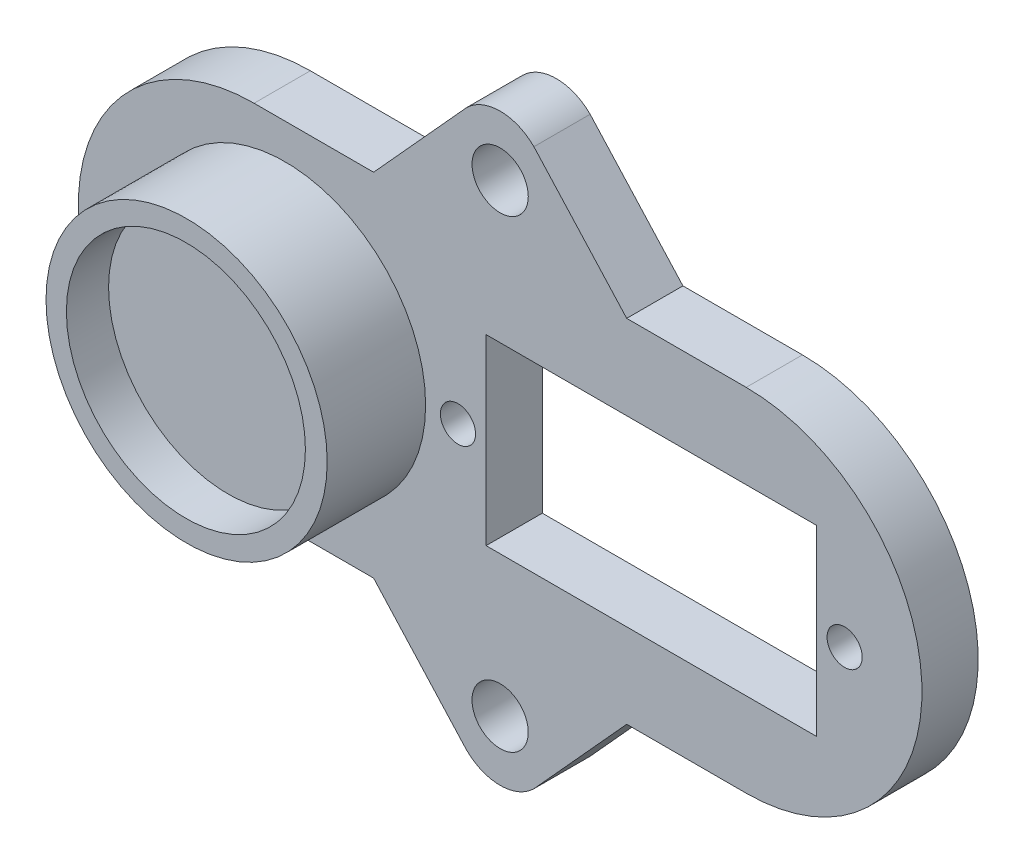
ISO-10303-21;
HEADER;
FILE_DESCRIPTION(('STEP AP214'),'2;1');
FILE_NAME('part.step','',(''),(''),'','','');
FILE_SCHEMA(('AUTOMOTIVE_DESIGN { 1 0 10303 214 1 1 1 1 }'));
ENDSEC;
DATA;
#1=APPLICATION_CONTEXT('core data for automotive mechanical design processes');
#2=APPLICATION_PROTOCOL_DEFINITION('international standard','automotive_design',2000,#1);
#3=PRODUCT_CONTEXT('',#1,'mechanical');
#4=PRODUCT('Part','Part','',(#3));
#5=PRODUCT_RELATED_PRODUCT_CATEGORY('part','',(#4));
#6=PRODUCT_DEFINITION_FORMATION('','',#4);
#7=PRODUCT_DEFINITION_CONTEXT('part definition',#1,'design');
#8=PRODUCT_DEFINITION('design','',#6,#7);
#9=PRODUCT_DEFINITION_SHAPE('','',#8);
#10=(LENGTH_UNIT() NAMED_UNIT(*) SI_UNIT(.MILLI.,.METRE.));
#11=(NAMED_UNIT(*) PLANE_ANGLE_UNIT() SI_UNIT($,.RADIAN.));
#12=(NAMED_UNIT(*) SI_UNIT($,.STERADIAN.) SOLID_ANGLE_UNIT());
#13=UNCERTAINTY_MEASURE_WITH_UNIT(LENGTH_MEASURE(1.E-05),#10,'distance_accuracy_value','');
#14=(GEOMETRIC_REPRESENTATION_CONTEXT(3) GLOBAL_UNCERTAINTY_ASSIGNED_CONTEXT((#13)) GLOBAL_UNIT_ASSIGNED_CONTEXT((#10,
#11,#12)) REPRESENTATION_CONTEXT('',''));
#15=CARTESIAN_POINT('',(0.,0.,0.));
#16=DIRECTION('',(0.,0.,1.));
#17=DIRECTION('',(1.,0.,0.));
#18=AXIS2_PLACEMENT_3D('',#15,#16,#17);
#19=CARTESIAN_POINT('',(17.5,0.,4.));
#20=DIRECTION('',(0.,0.,1.));
#21=DIRECTION('',(1.,0.,0.));
#22=AXIS2_PLACEMENT_3D('',#19,#20,#21);
#23=PLANE('',#22);
#24=CARTESIAN_POINT('',(-15.3,0.,4.));
#25=DIRECTION('',(0.,0.,1.));
#26=DIRECTION('',(1.,0.,0.));
#27=AXIS2_PLACEMENT_3D('',#24,#25,#26);
#28=CIRCLE('',#27,10.);
#29=CARTESIAN_POINT('',(-5.3,0.,4.));
#30=VERTEX_POINT('',#29);
#31=EDGE_CURVE('E644',#30,#30,#28,.T.);
#32=ORIENTED_EDGE('',*,*,#31,.F.);
#33=EDGE_LOOP('',(#32));
#34=FACE_BOUND('',#33,.T.);
#35=CARTESIAN_POINT('',(0.,-16.5,4.));
#36=DIRECTION('',(0.,0.,1.));
#37=DIRECTION('',(-1.,0.,0.));
#38=AXIS2_PLACEMENT_3D('',#35,#36,#37);
#39=CIRCLE('',#38,2.);
#40=CARTESIAN_POINT('',(-2.,-16.5,4.));
#41=VERTEX_POINT('',#40);
#42=EDGE_CURVE('E211',#41,#41,#39,.T.);
#43=ORIENTED_EDGE('',*,*,#42,.F.);
#44=EDGE_LOOP('',(#43));
#45=FACE_BOUND('',#44,.T.);
#46=CARTESIAN_POINT('',(-2.99999999999999,0.,4.));
#47=DIRECTION('',(0.,0.,1.));
#48=DIRECTION('',(1.,0.,0.));
#49=AXIS2_PLACEMENT_3D('',#46,#47,#48);
#50=CIRCLE('',#49,1.25);
#51=CARTESIAN_POINT('',(-1.74999999999999,0.,4.));
#52=VERTEX_POINT('',#51);
#53=EDGE_CURVE('E227',#52,#52,#50,.T.);
#54=ORIENTED_EDGE('',*,*,#53,.F.);
#55=EDGE_LOOP('',(#54));
#56=FACE_BOUND('',#55,.T.);
#57=CARTESIAN_POINT('',(17.5,0.,4.));
#58=DIRECTION('',(0.,0.,1.));
#59=DIRECTION('',(1.,0.,0.));
#60=AXIS2_PLACEMENT_3D('',#57,#58,#59);
#61=CIRCLE('',#60,12.5);
#62=CARTESIAN_POINT('',(17.5,-12.5,4.));
#63=VERTEX_POINT('',#62);
#64=CARTESIAN_POINT('',(17.5,12.5,4.));
#65=VERTEX_POINT('',#64);
#66=EDGE_CURVE('E235',#63,#65,#61,.T.);
#67=ORIENTED_EDGE('',*,*,#66,.T.);
#68=DIRECTION('',(-1.,0.,0.));
#69=VECTOR('',#68,1.);
#70=CARTESIAN_POINT('',(9.,12.5,4.));
#71=LINE('',#70,#69);
#72=CARTESIAN_POINT('',(9.,12.5,4.));
#73=VERTEX_POINT('',#72);
#74=EDGE_CURVE('E239',#65,#73,#71,.T.);
#75=ORIENTED_EDGE('',*,*,#74,.T.);
#76=DIRECTION('',(-0.671988671110962,0.740561426148111,0.));
#77=VECTOR('',#76,1.);
#78=CARTESIAN_POINT('',(2.4010102843855,19.772380391254,4.));
#79=LINE('',#78,#77);
#80=CARTESIAN_POINT('',(2.4010102843855,19.772380391254,4.));
#81=VERTEX_POINT('',#80);
#82=EDGE_CURVE('E243',#73,#81,#79,.T.);
#83=ORIENTED_EDGE('',*,*,#82,.T.);
#84=CARTESIAN_POINT('',(0.,17.3713701068685,4.));
#85=DIRECTION('',(0.,0.,1.));
#86=DIRECTION('',(-1.,0.,0.));
#87=AXIS2_PLACEMENT_3D('',#84,#85,#86);
#88=CIRCLE('',#87,3.39554130757526);
#89=CARTESIAN_POINT('',(-2.4010102843855,19.772380391254,4.));
#90=VERTEX_POINT('',#89);
#91=EDGE_CURVE('E246',#81,#90,#88,.T.);
#92=ORIENTED_EDGE('',*,*,#91,.T.);
#93=DIRECTION('',(-0.671988671110962,-0.740561426148111,0.));
#94=VECTOR('',#93,1.);
#95=CARTESIAN_POINT('',(-9.,12.5,4.));
#96=LINE('',#95,#94);
#97=CARTESIAN_POINT('',(-9.,12.5,4.));
#98=VERTEX_POINT('',#97);
#99=EDGE_CURVE('E249',#90,#98,#96,.T.);
#100=ORIENTED_EDGE('',*,*,#99,.T.);
#101=DIRECTION('',(-1.,0.,0.));
#102=VECTOR('',#101,1.);
#103=CARTESIAN_POINT('',(-17.5,12.5,4.));
#104=LINE('',#103,#102);
#105=CARTESIAN_POINT('',(-17.5,12.5,4.));
#106=VERTEX_POINT('',#105);
#107=EDGE_CURVE('E252',#98,#106,#104,.T.);
#108=ORIENTED_EDGE('',*,*,#107,.T.);
#109=CARTESIAN_POINT('',(-17.5,0.,4.));
#110=DIRECTION('',(0.,0.,1.));
#111=DIRECTION('',(1.,0.,0.));
#112=AXIS2_PLACEMENT_3D('',#109,#110,#111);
#113=CIRCLE('',#112,12.5);
#114=CARTESIAN_POINT('',(-17.5,-12.5,4.));
#115=VERTEX_POINT('',#114);
#116=EDGE_CURVE('E255',#106,#115,#113,.T.);
#117=ORIENTED_EDGE('',*,*,#116,.T.);
#118=DIRECTION('',(1.,0.,0.));
#119=VECTOR('',#118,1.);
#120=CARTESIAN_POINT('',(-17.5,-12.5,4.));
#121=LINE('',#120,#119);
#122=CARTESIAN_POINT('',(-9.,-12.5,4.));
#123=VERTEX_POINT('',#122);
#124=EDGE_CURVE('E258',#115,#123,#121,.T.);
#125=ORIENTED_EDGE('',*,*,#124,.T.);
#126=DIRECTION('',(0.671988671110962,-0.740561426148111,0.));
#127=VECTOR('',#126,1.);
#128=CARTESIAN_POINT('',(-9.,-12.5,4.));
#129=LINE('',#128,#127);
#130=CARTESIAN_POINT('',(-2.4010102843855,-19.772380391254,4.));
#131=VERTEX_POINT('',#130);
#132=EDGE_CURVE('E261',#123,#131,#129,.T.);
#133=ORIENTED_EDGE('',*,*,#132,.T.);
#134=CARTESIAN_POINT('',(0.,-17.3713701068685,4.));
#135=DIRECTION('',(0.,0.,1.));
#136=DIRECTION('',(1.,0.,0.));
#137=AXIS2_PLACEMENT_3D('',#134,#135,#136);
#138=CIRCLE('',#137,3.39554130757526);
#139=CARTESIAN_POINT('',(2.4010102843855,-19.772380391254,4.));
#140=VERTEX_POINT('',#139);
#141=EDGE_CURVE('E264',#131,#140,#138,.T.);
#142=ORIENTED_EDGE('',*,*,#141,.T.);
#143=DIRECTION('',(0.671988671110962,0.740561426148111,0.));
#144=VECTOR('',#143,1.);
#145=CARTESIAN_POINT('',(2.4010102843855,-19.772380391254,4.));
#146=LINE('',#145,#144);
#147=CARTESIAN_POINT('',(9.,-12.5,4.));
#148=VERTEX_POINT('',#147);
#149=EDGE_CURVE('E267',#140,#148,#146,.T.);
#150=ORIENTED_EDGE('',*,*,#149,.T.);
#151=DIRECTION('',(1.,0.,0.));
#152=VECTOR('',#151,1.);
#153=CARTESIAN_POINT('',(9.,-12.5,4.));
#154=LINE('',#153,#152);
#155=EDGE_CURVE('E270',#148,#63,#154,.T.);
#156=ORIENTED_EDGE('',*,*,#155,.T.);
#157=EDGE_LOOP('',(#67,#75,#83,#92,#100,#108,#117,#125,#133,#142,#150,#156));
#158=FACE_BOUND('',#157,.T.);
#159=CARTESIAN_POINT('',(0.,16.5,4.));
#160=DIRECTION('',(0.,0.,1.));
#161=DIRECTION('',(1.,0.,0.));
#162=AXIS2_PLACEMENT_3D('',#159,#160,#161);
#163=CIRCLE('',#162,2.);
#164=CARTESIAN_POINT('',(2.,16.5,4.));
#165=VERTEX_POINT('',#164);
#166=EDGE_CURVE('E219',#165,#165,#163,.T.);
#167=ORIENTED_EDGE('',*,*,#166,.F.);
#168=EDGE_LOOP('',(#167));
#169=FACE_BOUND('',#168,.T.);
#170=CARTESIAN_POINT('',(24.5,0.,4.));
#171=DIRECTION('',(0.,0.,1.));
#172=DIRECTION('',(1.,0.,0.));
#173=AXIS2_PLACEMENT_3D('',#170,#171,#172);
#174=CIRCLE('',#173,1.25);
#175=CARTESIAN_POINT('',(25.75,0.,4.));
#176=VERTEX_POINT('',#175);
#177=EDGE_CURVE('E203',#176,#176,#174,.T.);
#178=ORIENTED_EDGE('',*,*,#177,.F.);
#179=EDGE_LOOP('',(#178));
#180=FACE_BOUND('',#179,.T.);
#181=DIRECTION('',(1.,0.,0.));
#182=VECTOR('',#181,1.);
#183=CARTESIAN_POINT('',(-0.999999999999994,-6.5,4.));
#184=LINE('',#183,#182);
#185=CARTESIAN_POINT('',(-0.999999999999994,-6.5,4.));
#186=VERTEX_POINT('',#185);
#187=CARTESIAN_POINT('',(22.5,-6.5,4.));
#188=VERTEX_POINT('',#187);
#189=EDGE_CURVE('E162',#186,#188,#184,.T.);
#190=ORIENTED_EDGE('',*,*,#189,.F.);
#191=DIRECTION('',(0.,-1.,0.));
#192=VECTOR('',#191,1.);
#193=CARTESIAN_POINT('',(-0.999999999999994,6.5,4.));
#194=LINE('',#193,#192);
#195=CARTESIAN_POINT('',(-0.999999999999994,6.5,4.));
#196=VERTEX_POINT('',#195);
#197=EDGE_CURVE('E153',#196,#186,#194,.T.);
#198=ORIENTED_EDGE('',*,*,#197,.F.);
#199=DIRECTION('',(-1.,0.,0.));
#200=VECTOR('',#199,1.);
#201=CARTESIAN_POINT('',(-0.999999999999994,6.5,4.));
#202=LINE('',#201,#200);
#203=CARTESIAN_POINT('',(22.5,6.5,4.));
#204=VERTEX_POINT('',#203);
#205=EDGE_CURVE('E179',#204,#196,#202,.T.);
#206=ORIENTED_EDGE('',*,*,#205,.F.);
#207=DIRECTION('',(0.,1.,0.));
#208=VECTOR('',#207,1.);
#209=CARTESIAN_POINT('',(22.5,6.5,4.));
#210=LINE('',#209,#208);
#211=EDGE_CURVE('E175',#188,#204,#210,.T.);
#212=ORIENTED_EDGE('',*,*,#211,.F.);
#213=EDGE_LOOP('',(#190,#198,#206,#212));
#214=FACE_BOUND('',#213,.T.);
#215=ADVANCED_FACE('F39',(#34,#45,#56,#158,#169,#180,#214),#23,.T.);
#216=CARTESIAN_POINT('',(17.5,0.,0.));
#217=DIRECTION('',(0.,0.,1.));
#218=DIRECTION('',(1.,0.,0.));
#219=AXIS2_PLACEMENT_3D('',#216,#217,#218);
#220=PLANE('',#219);
#221=CARTESIAN_POINT('',(24.5,0.,0.));
#222=DIRECTION('',(0.,0.,1.));
#223=DIRECTION('',(1.,0.,0.));
#224=AXIS2_PLACEMENT_3D('',#221,#222,#223);
#225=CIRCLE('',#224,1.25);
#226=CARTESIAN_POINT('',(25.75,0.,0.));
#227=VERTEX_POINT('',#226);
#228=EDGE_CURVE('E171',#227,#227,#225,.T.);
#229=ORIENTED_EDGE('',*,*,#228,.T.);
#230=EDGE_LOOP('',(#229));
#231=FACE_BOUND('',#230,.T.);
#232=CARTESIAN_POINT('',(0.,-16.5,0.));
#233=DIRECTION('',(0.,0.,1.));
#234=DIRECTION('',(-1.,0.,0.));
#235=AXIS2_PLACEMENT_3D('',#232,#233,#234);
#236=CIRCLE('',#235,2.);
#237=CARTESIAN_POINT('',(-2.,-16.5,0.));
#238=VERTEX_POINT('',#237);
#239=EDGE_CURVE('E207',#238,#238,#236,.T.);
#240=ORIENTED_EDGE('',*,*,#239,.T.);
#241=EDGE_LOOP('',(#240));
#242=FACE_BOUND('',#241,.T.);
#243=CARTESIAN_POINT('',(0.,16.5,0.));
#244=DIRECTION('',(0.,0.,1.));
#245=DIRECTION('',(1.,0.,0.));
#246=AXIS2_PLACEMENT_3D('',#243,#244,#245);
#247=CIRCLE('',#246,2.);
#248=CARTESIAN_POINT('',(2.,16.5,0.));
#249=VERTEX_POINT('',#248);
#250=EDGE_CURVE('E215',#249,#249,#247,.T.);
#251=ORIENTED_EDGE('',*,*,#250,.T.);
#252=EDGE_LOOP('',(#251));
#253=FACE_BOUND('',#252,.T.);
#254=CARTESIAN_POINT('',(-2.99999999999999,0.,0.));
#255=DIRECTION('',(0.,0.,1.));
#256=DIRECTION('',(1.,0.,0.));
#257=AXIS2_PLACEMENT_3D('',#254,#255,#256);
#258=CIRCLE('',#257,1.25);
#259=CARTESIAN_POINT('',(-1.74999999999999,0.,0.));
#260=VERTEX_POINT('',#259);
#261=EDGE_CURVE('E223',#260,#260,#258,.T.);
#262=ORIENTED_EDGE('',*,*,#261,.T.);
#263=EDGE_LOOP('',(#262));
#264=FACE_BOUND('',#263,.T.);
#265=CARTESIAN_POINT('',(17.5,0.,0.));
#266=DIRECTION('',(0.,0.,1.));
#267=DIRECTION('',(1.,0.,0.));
#268=AXIS2_PLACEMENT_3D('',#265,#266,#267);
#269=CIRCLE('',#268,12.5);
#270=CARTESIAN_POINT('',(17.5,-12.5,0.));
#271=VERTEX_POINT('',#270);
#272=CARTESIAN_POINT('',(17.5,12.5,0.));
#273=VERTEX_POINT('',#272);
#274=EDGE_CURVE('E231',#271,#273,#269,.T.);
#275=ORIENTED_EDGE('',*,*,#274,.F.);
#276=DIRECTION('',(1.,0.,0.));
#277=VECTOR('',#276,1.);
#278=CARTESIAN_POINT('',(9.,-12.5,0.));
#279=LINE('',#278,#277);
#280=CARTESIAN_POINT('',(9.,-12.5,0.));
#281=VERTEX_POINT('',#280);
#282=EDGE_CURVE('E240',#281,#271,#279,.T.);
#283=ORIENTED_EDGE('',*,*,#282,.F.);
#284=DIRECTION('',(0.671988671110962,0.740561426148111,0.));
#285=VECTOR('',#284,1.);
#286=CARTESIAN_POINT('',(2.4010102843855,-19.772380391254,0.));
#287=LINE('',#286,#285);
#288=CARTESIAN_POINT('',(2.4010102843855,-19.772380391254,0.));
#289=VERTEX_POINT('',#288);
#290=EDGE_CURVE('E304',#289,#281,#287,.T.);
#291=ORIENTED_EDGE('',*,*,#290,.F.);
#292=CARTESIAN_POINT('',(0.,-17.3713701068685,0.));
#293=DIRECTION('',(0.,0.,1.));
#294=DIRECTION('',(1.,0.,0.));
#295=AXIS2_PLACEMENT_3D('',#292,#293,#294);
#296=CIRCLE('',#295,3.39554130757526);
#297=CARTESIAN_POINT('',(-2.4010102843855,-19.772380391254,0.));
#298=VERTEX_POINT('',#297);
#299=EDGE_CURVE('E301',#298,#289,#296,.T.);
#300=ORIENTED_EDGE('',*,*,#299,.F.);
#301=DIRECTION('',(0.671988671110962,-0.740561426148111,0.));
#302=VECTOR('',#301,1.);
#303=CARTESIAN_POINT('',(-9.,-12.5,0.));
#304=LINE('',#303,#302);
#305=CARTESIAN_POINT('',(-9.,-12.5,0.));
#306=VERTEX_POINT('',#305);
#307=EDGE_CURVE('E298',#306,#298,#304,.T.);
#308=ORIENTED_EDGE('',*,*,#307,.F.);
#309=DIRECTION('',(1.,0.,0.));
#310=VECTOR('',#309,1.);
#311=CARTESIAN_POINT('',(-17.5,-12.5,0.));
#312=LINE('',#311,#310);
#313=CARTESIAN_POINT('',(-17.5,-12.5,0.));
#314=VERTEX_POINT('',#313);
#315=EDGE_CURVE('E295',#314,#306,#312,.T.);
#316=ORIENTED_EDGE('',*,*,#315,.F.);
#317=CARTESIAN_POINT('',(-17.5,0.,0.));
#318=DIRECTION('',(0.,0.,1.));
#319=DIRECTION('',(1.,0.,0.));
#320=AXIS2_PLACEMENT_3D('',#317,#318,#319);
#321=CIRCLE('',#320,12.5);
#322=CARTESIAN_POINT('',(-17.5,12.5,0.));
#323=VERTEX_POINT('',#322);
#324=EDGE_CURVE('E292',#323,#314,#321,.T.);
#325=ORIENTED_EDGE('',*,*,#324,.F.);
#326=DIRECTION('',(-1.,0.,0.));
#327=VECTOR('',#326,1.);
#328=CARTESIAN_POINT('',(-17.5,12.5,0.));
#329=LINE('',#328,#327);
#330=CARTESIAN_POINT('',(-9.,12.5,0.));
#331=VERTEX_POINT('',#330);
#332=EDGE_CURVE('E289',#331,#323,#329,.T.);
#333=ORIENTED_EDGE('',*,*,#332,.F.);
#334=DIRECTION('',(-0.671988671110962,-0.740561426148111,0.));
#335=VECTOR('',#334,1.);
#336=CARTESIAN_POINT('',(-9.,12.5,0.));
#337=LINE('',#336,#335);
#338=CARTESIAN_POINT('',(-2.4010102843855,19.772380391254,0.));
#339=VERTEX_POINT('',#338);
#340=EDGE_CURVE('E286',#339,#331,#337,.T.);
#341=ORIENTED_EDGE('',*,*,#340,.F.);
#342=CARTESIAN_POINT('',(0.,17.3713701068685,0.));
#343=DIRECTION('',(0.,0.,1.));
#344=DIRECTION('',(-1.,0.,0.));
#345=AXIS2_PLACEMENT_3D('',#342,#343,#344);
#346=CIRCLE('',#345,3.39554130757526);
#347=CARTESIAN_POINT('',(2.4010102843855,19.772380391254,0.));
#348=VERTEX_POINT('',#347);
#349=EDGE_CURVE('E283',#348,#339,#346,.T.);
#350=ORIENTED_EDGE('',*,*,#349,.F.);
#351=DIRECTION('',(-0.671988671110962,0.740561426148111,0.));
#352=VECTOR('',#351,1.);
#353=CARTESIAN_POINT('',(2.4010102843855,19.772380391254,0.));
#354=LINE('',#353,#352);
#355=CARTESIAN_POINT('',(9.,12.5,0.));
#356=VERTEX_POINT('',#355);
#357=EDGE_CURVE('E280',#356,#348,#354,.T.);
#358=ORIENTED_EDGE('',*,*,#357,.F.);
#359=DIRECTION('',(-1.,0.,0.));
#360=VECTOR('',#359,1.);
#361=CARTESIAN_POINT('',(9.,12.5,0.));
#362=LINE('',#361,#360);
#363=EDGE_CURVE('E277',#273,#356,#362,.T.);
#364=ORIENTED_EDGE('',*,*,#363,.F.);
#365=EDGE_LOOP('',(#275,#283,#291,#300,#308,#316,#325,#333,#341,#350,#358,#364));
#366=FACE_BOUND('',#365,.T.);
#367=DIRECTION('',(0.,-1.,0.));
#368=VECTOR('',#367,1.);
#369=CARTESIAN_POINT('',(-0.999999999999994,6.5,0.));
#370=LINE('',#369,#368);
#371=CARTESIAN_POINT('',(-0.999999999999994,6.5,0.));
#372=VERTEX_POINT('',#371);
#373=CARTESIAN_POINT('',(-0.999999999999994,-6.5,0.));
#374=VERTEX_POINT('',#373);
#375=EDGE_CURVE('E63',#372,#374,#370,.T.);
#376=ORIENTED_EDGE('',*,*,#375,.T.);
#377=DIRECTION('',(1.,0.,0.));
#378=VECTOR('',#377,1.);
#379=CARTESIAN_POINT('',(-0.999999999999994,-6.5,0.));
#380=LINE('',#379,#378);
#381=CARTESIAN_POINT('',(22.5,-6.5,0.));
#382=VERTEX_POINT('',#381);
#383=EDGE_CURVE('E169',#374,#382,#380,.T.);
#384=ORIENTED_EDGE('',*,*,#383,.T.);
#385=DIRECTION('',(0.,1.,0.));
#386=VECTOR('',#385,1.);
#387=CARTESIAN_POINT('',(22.5,6.5,0.));
#388=LINE('',#387,#386);
#389=CARTESIAN_POINT('',(22.5,6.5,0.));
#390=VERTEX_POINT('',#389);
#391=EDGE_CURVE('E190',#382,#390,#388,.T.);
#392=ORIENTED_EDGE('',*,*,#391,.T.);
#393=DIRECTION('',(-1.,0.,0.));
#394=VECTOR('',#393,1.);
#395=CARTESIAN_POINT('',(-0.999999999999994,6.5,0.));
#396=LINE('',#395,#394);
#397=EDGE_CURVE('E163',#390,#372,#396,.T.);
#398=ORIENTED_EDGE('',*,*,#397,.T.);
#399=EDGE_LOOP('',(#376,#384,#392,#398));
#400=FACE_BOUND('',#399,.T.);
#401=ADVANCED_FACE('F359',(#231,#242,#253,#264,#366,#400),#220,.F.);
#402=CARTESIAN_POINT('',(17.5,0.,4.));
#403=DIRECTION('',(0.,0.,-1.));
#404=DIRECTION('',(-1.,0.,0.));
#405=AXIS2_PLACEMENT_3D('',#402,#403,#404);
#406=CYLINDRICAL_SURFACE('',#405,12.5);
#407=ORIENTED_EDGE('',*,*,#274,.T.);
#408=DIRECTION('',(0.,0.,-1.));
#409=VECTOR('',#408,1.);
#410=CARTESIAN_POINT('',(17.5,12.5,4.));
#411=LINE('',#410,#409);
#412=EDGE_CURVE('E11',#65,#273,#411,.T.);
#413=ORIENTED_EDGE('',*,*,#412,.F.);
#414=ORIENTED_EDGE('',*,*,#66,.F.);
#415=DIRECTION('',(0.,0.,-1.));
#416=VECTOR('',#415,1.);
#417=CARTESIAN_POINT('',(17.5,-12.5,4.));
#418=LINE('',#417,#416);
#419=EDGE_CURVE('E273',#63,#271,#418,.T.);
#420=ORIENTED_EDGE('',*,*,#419,.T.);
#421=EDGE_LOOP('',(#407,#413,#414,#420));
#422=FACE_BOUND('',#421,.T.);
#423=ADVANCED_FACE('F41',(#422),#406,.T.);
#424=CARTESIAN_POINT('',(9.,12.5,4.));
#425=DIRECTION('',(0.,-1.,0.));
#426=DIRECTION('',(1.,0.,0.));
#427=AXIS2_PLACEMENT_3D('',#424,#425,#426);
#428=PLANE('',#427);
#429=ORIENTED_EDGE('',*,*,#363,.T.);
#430=DIRECTION('',(0.,0.,-1.));
#431=VECTOR('',#430,1.);
#432=CARTESIAN_POINT('',(9.,12.5,4.));
#433=LINE('',#432,#431);
#434=EDGE_CURVE('E48',#73,#356,#433,.T.);
#435=ORIENTED_EDGE('',*,*,#434,.F.);
#436=ORIENTED_EDGE('',*,*,#74,.F.);
#437=ORIENTED_EDGE('',*,*,#412,.T.);
#438=EDGE_LOOP('',(#429,#435,#436,#437));
#439=FACE_BOUND('',#438,.T.);
#440=ADVANCED_FACE('F377',(#439),#428,.F.);
#441=CARTESIAN_POINT('',(2.4010102843855,19.772380391254,4.));
#442=DIRECTION('',(-0.740561426148111,-0.671988671110962,0.));
#443=DIRECTION('',(0.671988671110962,-0.740561426148111,0.));
#444=AXIS2_PLACEMENT_3D('',#441,#442,#443);
#445=PLANE('',#444);
#446=ORIENTED_EDGE('',*,*,#357,.T.);
#447=DIRECTION('',(0.,0.,-1.));
#448=VECTOR('',#447,1.);
#449=CARTESIAN_POINT('',(2.4010102843855,19.772380391254,4.));
#450=LINE('',#449,#448);
#451=EDGE_CURVE('E344',#81,#348,#450,.T.);
#452=ORIENTED_EDGE('',*,*,#451,.F.);
#453=ORIENTED_EDGE('',*,*,#82,.F.);
#454=ORIENTED_EDGE('',*,*,#434,.T.);
#455=EDGE_LOOP('',(#446,#452,#453,#454));
#456=FACE_BOUND('',#455,.T.);
#457=ADVANCED_FACE('F353',(#456),#445,.F.);
#458=CARTESIAN_POINT('',(0.,17.3713701068685,4.));
#459=DIRECTION('',(0.,0.,-1.));
#460=DIRECTION('',(-1.,0.,0.));
#461=AXIS2_PLACEMENT_3D('',#458,#459,#460);
#462=CYLINDRICAL_SURFACE('',#461,3.39554130757526);
#463=ORIENTED_EDGE('',*,*,#349,.T.);
#464=DIRECTION('',(0.,0.,-1.));
#465=VECTOR('',#464,1.);
#466=CARTESIAN_POINT('',(-2.4010102843855,19.772380391254,4.));
#467=LINE('',#466,#465);
#468=EDGE_CURVE('E340',#90,#339,#467,.T.);
#469=ORIENTED_EDGE('',*,*,#468,.F.);
#470=ORIENTED_EDGE('',*,*,#91,.F.);
#471=ORIENTED_EDGE('',*,*,#451,.T.);
#472=EDGE_LOOP('',(#463,#469,#470,#471));
#473=FACE_BOUND('',#472,.T.);
#474=ADVANCED_FACE('F365',(#473),#462,.T.);
#475=CARTESIAN_POINT('',(-9.,12.5,4.));
#476=DIRECTION('',(0.740561426148111,-0.671988671110962,0.));
#477=DIRECTION('',(0.671988671110962,0.740561426148111,0.));
#478=AXIS2_PLACEMENT_3D('',#475,#476,#477);
#479=PLANE('',#478);
#480=ORIENTED_EDGE('',*,*,#340,.T.);
#481=DIRECTION('',(0.,0.,-1.));
#482=VECTOR('',#481,1.);
#483=CARTESIAN_POINT('',(-9.,12.5,4.));
#484=LINE('',#483,#482);
#485=EDGE_CURVE('E336',#98,#331,#484,.T.);
#486=ORIENTED_EDGE('',*,*,#485,.F.);
#487=ORIENTED_EDGE('',*,*,#99,.F.);
#488=ORIENTED_EDGE('',*,*,#468,.T.);
#489=EDGE_LOOP('',(#480,#486,#487,#488));
#490=FACE_BOUND('',#489,.T.);
#491=ADVANCED_FACE('F369',(#490),#479,.F.);
#492=CARTESIAN_POINT('',(-17.5,12.5,4.));
#493=DIRECTION('',(0.,-1.,0.));
#494=DIRECTION('',(1.,0.,0.));
#495=AXIS2_PLACEMENT_3D('',#492,#493,#494);
#496=PLANE('',#495);
#497=ORIENTED_EDGE('',*,*,#332,.T.);
#498=DIRECTION('',(0.,0.,-1.));
#499=VECTOR('',#498,1.);
#500=CARTESIAN_POINT('',(-17.5,12.5,4.));
#501=LINE('',#500,#499);
#502=EDGE_CURVE('E332',#106,#323,#501,.T.);
#503=ORIENTED_EDGE('',*,*,#502,.F.);
#504=ORIENTED_EDGE('',*,*,#107,.F.);
#505=ORIENTED_EDGE('',*,*,#485,.T.);
#506=EDGE_LOOP('',(#497,#503,#504,#505));
#507=FACE_BOUND('',#506,.T.);
#508=ADVANCED_FACE('F410',(#507),#496,.F.);
#509=CARTESIAN_POINT('',(-17.5,0.,4.));
#510=DIRECTION('',(0.,0.,-1.));
#511=DIRECTION('',(-1.,0.,0.));
#512=AXIS2_PLACEMENT_3D('',#509,#510,#511);
#513=CYLINDRICAL_SURFACE('',#512,12.5);
#514=ORIENTED_EDGE('',*,*,#324,.T.);
#515=DIRECTION('',(0.,0.,-1.));
#516=VECTOR('',#515,1.);
#517=CARTESIAN_POINT('',(-17.5,-12.5,4.));
#518=LINE('',#517,#516);
#519=EDGE_CURVE('E328',#115,#314,#518,.T.);
#520=ORIENTED_EDGE('',*,*,#519,.F.);
#521=ORIENTED_EDGE('',*,*,#116,.F.);
#522=ORIENTED_EDGE('',*,*,#502,.T.);
#523=EDGE_LOOP('',(#514,#520,#521,#522));
#524=FACE_BOUND('',#523,.T.);
#525=ADVANCED_FACE('F408',(#524),#513,.T.);
#526=CARTESIAN_POINT('',(-17.5,-12.5,4.));
#527=DIRECTION('',(0.,1.,0.));
#528=DIRECTION('',(-1.,0.,0.));
#529=AXIS2_PLACEMENT_3D('',#526,#527,#528);
#530=PLANE('',#529);
#531=ORIENTED_EDGE('',*,*,#315,.T.);
#532=DIRECTION('',(0.,0.,-1.));
#533=VECTOR('',#532,1.);
#534=CARTESIAN_POINT('',(-9.,-12.5,4.));
#535=LINE('',#534,#533);
#536=EDGE_CURVE('E324',#123,#306,#535,.T.);
#537=ORIENTED_EDGE('',*,*,#536,.F.);
#538=ORIENTED_EDGE('',*,*,#124,.F.);
#539=ORIENTED_EDGE('',*,*,#519,.T.);
#540=EDGE_LOOP('',(#531,#537,#538,#539));
#541=FACE_BOUND('',#540,.T.);
#542=ADVANCED_FACE('F404',(#541),#530,.F.);
#543=CARTESIAN_POINT('',(-9.,-12.5,4.));
#544=DIRECTION('',(0.740561426148111,0.671988671110962,0.));
#545=DIRECTION('',(-0.671988671110962,0.740561426148111,0.));
#546=AXIS2_PLACEMENT_3D('',#543,#544,#545);
#547=PLANE('',#546);
#548=ORIENTED_EDGE('',*,*,#307,.T.);
#549=DIRECTION('',(0.,0.,-1.));
#550=VECTOR('',#549,1.);
#551=CARTESIAN_POINT('',(-2.4010102843855,-19.772380391254,4.));
#552=LINE('',#551,#550);
#553=EDGE_CURVE('E320',#131,#298,#552,.T.);
#554=ORIENTED_EDGE('',*,*,#553,.F.);
#555=ORIENTED_EDGE('',*,*,#132,.F.);
#556=ORIENTED_EDGE('',*,*,#536,.T.);
#557=EDGE_LOOP('',(#548,#554,#555,#556));
#558=FACE_BOUND('',#557,.T.);
#559=ADVANCED_FACE('F399',(#558),#547,.F.);
#560=CARTESIAN_POINT('',(0.,-17.3713701068685,4.));
#561=DIRECTION('',(0.,0.,-1.));
#562=DIRECTION('',(-1.,0.,0.));
#563=AXIS2_PLACEMENT_3D('',#560,#561,#562);
#564=CYLINDRICAL_SURFACE('',#563,3.39554130757526);
#565=ORIENTED_EDGE('',*,*,#299,.T.);
#566=DIRECTION('',(0.,0.,-1.));
#567=VECTOR('',#566,1.);
#568=CARTESIAN_POINT('',(2.4010102843855,-19.772380391254,4.));
#569=LINE('',#568,#567);
#570=EDGE_CURVE('E316',#140,#289,#569,.T.);
#571=ORIENTED_EDGE('',*,*,#570,.F.);
#572=ORIENTED_EDGE('',*,*,#141,.F.);
#573=ORIENTED_EDGE('',*,*,#553,.T.);
#574=EDGE_LOOP('',(#565,#571,#572,#573));
#575=FACE_BOUND('',#574,.T.);
#576=ADVANCED_FACE('F393',(#575),#564,.T.);
#577=CARTESIAN_POINT('',(2.4010102843855,-19.772380391254,4.));
#578=DIRECTION('',(-0.740561426148111,0.671988671110962,0.));
#579=DIRECTION('',(-0.671988671110962,-0.740561426148111,0.));
#580=AXIS2_PLACEMENT_3D('',#577,#578,#579);
#581=PLANE('',#580);
#582=ORIENTED_EDGE('',*,*,#290,.T.);
#583=DIRECTION('',(0.,0.,-1.));
#584=VECTOR('',#583,1.);
#585=CARTESIAN_POINT('',(9.,-12.5,4.));
#586=LINE('',#585,#584);
#587=EDGE_CURVE('E312',#148,#281,#586,.T.);
#588=ORIENTED_EDGE('',*,*,#587,.F.);
#589=ORIENTED_EDGE('',*,*,#149,.F.);
#590=ORIENTED_EDGE('',*,*,#570,.T.);
#591=EDGE_LOOP('',(#582,#588,#589,#590));
#592=FACE_BOUND('',#591,.T.);
#593=ADVANCED_FACE('F389',(#592),#581,.F.);
#594=CARTESIAN_POINT('',(9.,-12.5,4.));
#595=DIRECTION('',(0.,1.,0.));
#596=DIRECTION('',(-1.,0.,0.));
#597=AXIS2_PLACEMENT_3D('',#594,#595,#596);
#598=PLANE('',#597);
#599=ORIENTED_EDGE('',*,*,#282,.T.);
#600=ORIENTED_EDGE('',*,*,#419,.F.);
#601=ORIENTED_EDGE('',*,*,#155,.F.);
#602=ORIENTED_EDGE('',*,*,#587,.T.);
#603=EDGE_LOOP('',(#599,#600,#601,#602));
#604=FACE_BOUND('',#603,.T.);
#605=ADVANCED_FACE('F384',(#604),#598,.F.);
#606=CARTESIAN_POINT('',(-2.99999999999999,0.,4.));
#607=DIRECTION('',(0.,0.,-1.));
#608=DIRECTION('',(-1.,0.,0.));
#609=AXIS2_PLACEMENT_3D('',#606,#607,#608);
#610=CYLINDRICAL_SURFACE('',#609,1.25);
#611=ORIENTED_EDGE('',*,*,#53,.T.);
#612=EDGE_LOOP('',(#611));
#613=FACE_BOUND('',#612,.T.);
#614=ORIENTED_EDGE('',*,*,#261,.F.);
#615=EDGE_LOOP('',(#614));
#616=FACE_BOUND('',#615,.T.);
#617=ADVANCED_FACE('F430',(#613,#616),#610,.F.);
#618=CARTESIAN_POINT('',(0.,16.5,4.));
#619=DIRECTION('',(0.,0.,-1.));
#620=DIRECTION('',(-1.,0.,0.));
#621=AXIS2_PLACEMENT_3D('',#618,#619,#620);
#622=CYLINDRICAL_SURFACE('',#621,2.);
#623=ORIENTED_EDGE('',*,*,#166,.T.);
#624=EDGE_LOOP('',(#623));
#625=FACE_BOUND('',#624,.T.);
#626=ORIENTED_EDGE('',*,*,#250,.F.);
#627=EDGE_LOOP('',(#626));
#628=FACE_BOUND('',#627,.T.);
#629=ADVANCED_FACE('F468',(#625,#628),#622,.F.);
#630=CARTESIAN_POINT('',(0.,-16.5,4.));
#631=DIRECTION('',(0.,0.,-1.));
#632=DIRECTION('',(-1.,0.,0.));
#633=AXIS2_PLACEMENT_3D('',#630,#631,#632);
#634=CYLINDRICAL_SURFACE('',#633,2.);
#635=ORIENTED_EDGE('',*,*,#42,.T.);
#636=EDGE_LOOP('',(#635));
#637=FACE_BOUND('',#636,.T.);
#638=ORIENTED_EDGE('',*,*,#239,.F.);
#639=EDGE_LOOP('',(#638));
#640=FACE_BOUND('',#639,.T.);
#641=ADVANCED_FACE('F475',(#637,#640),#634,.F.);
#642=CARTESIAN_POINT('',(24.5,0.,4.));
#643=DIRECTION('',(0.,0.,-1.));
#644=DIRECTION('',(-1.,0.,0.));
#645=AXIS2_PLACEMENT_3D('',#642,#643,#644);
#646=CYLINDRICAL_SURFACE('',#645,1.25);
#647=ORIENTED_EDGE('',*,*,#177,.T.);
#648=EDGE_LOOP('',(#647));
#649=FACE_BOUND('',#648,.T.);
#650=ORIENTED_EDGE('',*,*,#228,.F.);
#651=EDGE_LOOP('',(#650));
#652=FACE_BOUND('',#651,.T.);
#653=ADVANCED_FACE('F482',(#649,#652),#646,.F.);
#654=CARTESIAN_POINT('',(-0.999999999999994,6.5,4.));
#655=DIRECTION('',(1.,0.,0.));
#656=DIRECTION('',(0.,0.,-1.));
#657=AXIS2_PLACEMENT_3D('',#654,#655,#656);
#658=PLANE('',#657);
#659=ORIENTED_EDGE('',*,*,#375,.F.);
#660=DIRECTION('',(0.,0.,-1.));
#661=VECTOR('',#660,1.);
#662=CARTESIAN_POINT('',(-0.999999999999994,6.5,4.));
#663=LINE('',#662,#661);
#664=EDGE_CURVE('E157',#196,#372,#663,.T.);
#665=ORIENTED_EDGE('',*,*,#664,.F.);
#666=ORIENTED_EDGE('',*,*,#197,.T.);
#667=DIRECTION('',(0.,0.,-1.));
#668=VECTOR('',#667,1.);
#669=CARTESIAN_POINT('',(-0.999999999999994,-6.5,4.));
#670=LINE('',#669,#668);
#671=EDGE_CURVE('E156',#186,#374,#670,.T.);
#672=ORIENTED_EDGE('',*,*,#671,.T.);
#673=EDGE_LOOP('',(#659,#665,#666,#672));
#674=FACE_BOUND('',#673,.T.);
#675=ADVANCED_FACE('F155',(#674),#658,.T.);
#676=CARTESIAN_POINT('',(-0.999999999999994,-6.5,4.));
#677=DIRECTION('',(0.,1.,0.));
#678=DIRECTION('',(0.,0.,1.));
#679=AXIS2_PLACEMENT_3D('',#676,#677,#678);
#680=PLANE('',#679);
#681=ORIENTED_EDGE('',*,*,#383,.F.);
#682=ORIENTED_EDGE('',*,*,#671,.F.);
#683=ORIENTED_EDGE('',*,*,#189,.T.);
#684=DIRECTION('',(0.,0.,-1.));
#685=VECTOR('',#684,1.);
#686=CARTESIAN_POINT('',(22.5,-6.5,4.));
#687=LINE('',#686,#685);
#688=EDGE_CURVE('E172',#188,#382,#687,.T.);
#689=ORIENTED_EDGE('',*,*,#688,.T.);
#690=EDGE_LOOP('',(#681,#682,#683,#689));
#691=FACE_BOUND('',#690,.T.);
#692=ADVANCED_FACE('F166',(#691),#680,.T.);
#693=CARTESIAN_POINT('',(22.5,6.5,4.));
#694=DIRECTION('',(-1.,0.,0.));
#695=DIRECTION('',(0.,0.,1.));
#696=AXIS2_PLACEMENT_3D('',#693,#694,#695);
#697=PLANE('',#696);
#698=ORIENTED_EDGE('',*,*,#391,.F.);
#699=ORIENTED_EDGE('',*,*,#688,.F.);
#700=ORIENTED_EDGE('',*,*,#211,.T.);
#701=DIRECTION('',(0.,0.,-1.));
#702=VECTOR('',#701,1.);
#703=CARTESIAN_POINT('',(22.5,6.5,4.));
#704=LINE('',#703,#702);
#705=EDGE_CURVE('E55',#204,#390,#704,.T.);
#706=ORIENTED_EDGE('',*,*,#705,.T.);
#707=EDGE_LOOP('',(#698,#699,#700,#706));
#708=FACE_BOUND('',#707,.T.);
#709=ADVANCED_FACE('F503',(#708),#697,.T.);
#710=CARTESIAN_POINT('',(-0.999999999999994,6.5,4.));
#711=DIRECTION('',(0.,-1.,0.));
#712=DIRECTION('',(0.,0.,-1.));
#713=AXIS2_PLACEMENT_3D('',#710,#711,#712);
#714=PLANE('',#713);
#715=ORIENTED_EDGE('',*,*,#397,.F.);
#716=ORIENTED_EDGE('',*,*,#705,.F.);
#717=ORIENTED_EDGE('',*,*,#205,.T.);
#718=ORIENTED_EDGE('',*,*,#664,.T.);
#719=EDGE_LOOP('',(#715,#716,#717,#718));
#720=FACE_BOUND('',#719,.T.);
#721=ADVANCED_FACE('F510',(#720),#714,.T.);
#722=CARTESIAN_POINT('',(-15.3,0.,11.));
#723=DIRECTION('',(0.,0.,-1.));
#724=DIRECTION('',(-1.,0.,0.));
#725=AXIS2_PLACEMENT_3D('',#722,#723,#724);
#726=CYLINDRICAL_SURFACE('',#725,10.);
#727=CARTESIAN_POINT('',(-15.3,0.,11.));
#728=DIRECTION('',(0.,0.,1.));
#729=DIRECTION('',(1.,0.,0.));
#730=AXIS2_PLACEMENT_3D('',#727,#728,#729);
#731=CIRCLE('',#730,10.);
#732=CARTESIAN_POINT('',(-5.3,0.,11.));
#733=VERTEX_POINT('',#732);
#734=EDGE_CURVE('E187',#733,#733,#731,.T.);
#735=ORIENTED_EDGE('',*,*,#734,.F.);
#736=EDGE_LOOP('',(#735));
#737=FACE_BOUND('',#736,.T.);
#738=ORIENTED_EDGE('',*,*,#31,.T.);
#739=EDGE_LOOP('',(#738));
#740=FACE_BOUND('',#739,.T.);
#741=ADVANCED_FACE('F518',(#737,#740),#726,.T.);
#742=CARTESIAN_POINT('',(-15.3,0.,11.));
#743=DIRECTION('',(0.,0.,1.));
#744=DIRECTION('',(1.,0.,0.));
#745=AXIS2_PLACEMENT_3D('',#742,#743,#744);
#746=PLANE('',#745);
#747=CARTESIAN_POINT('',(-15.35,0.,11.));
#748=DIRECTION('',(0.,0.,1.));
#749=DIRECTION('',(1.,0.,0.));
#750=AXIS2_PLACEMENT_3D('',#747,#748,#749);
#751=CIRCLE('',#750,8.5);
#752=CARTESIAN_POINT('',(-6.85,0.,11.));
#753=VERTEX_POINT('',#752);
#754=EDGE_CURVE('E645',#753,#753,#751,.T.);
#755=ORIENTED_EDGE('',*,*,#754,.F.);
#756=EDGE_LOOP('',(#755));
#757=FACE_BOUND('',#756,.T.);
#758=ORIENTED_EDGE('',*,*,#734,.T.);
#759=EDGE_LOOP('',(#758));
#760=FACE_BOUND('',#759,.T.);
#761=ADVANCED_FACE('F525',(#757,#760),#746,.T.);
#762=CARTESIAN_POINT('',(-15.35,0.,8.));
#763=DIRECTION('',(0.,0.,1.));
#764=DIRECTION('',(1.,0.,0.));
#765=AXIS2_PLACEMENT_3D('',#762,#763,#764);
#766=CYLINDRICAL_SURFACE('',#765,8.5);
#767=CARTESIAN_POINT('',(-15.35,0.,8.));
#768=DIRECTION('',(0.,0.,1.));
#769=DIRECTION('',(1.,0.,0.));
#770=AXIS2_PLACEMENT_3D('',#767,#768,#769);
#771=CIRCLE('',#770,8.5);
#772=CARTESIAN_POINT('',(-6.85,0.,8.));
#773=VERTEX_POINT('',#772);
#774=EDGE_CURVE('E642',#773,#773,#771,.T.);
#775=ORIENTED_EDGE('',*,*,#774,.F.);
#776=EDGE_LOOP('',(#775));
#777=FACE_BOUND('',#776,.T.);
#778=ORIENTED_EDGE('',*,*,#754,.T.);
#779=EDGE_LOOP('',(#778));
#780=FACE_BOUND('',#779,.T.);
#781=ADVANCED_FACE('F533',(#777,#780),#766,.F.);
#782=CARTESIAN_POINT('',(-15.35,0.,8.));
#783=DIRECTION('',(0.,0.,1.));
#784=DIRECTION('',(1.,0.,0.));
#785=AXIS2_PLACEMENT_3D('',#782,#783,#784);
#786=PLANE('',#785);
#787=ORIENTED_EDGE('',*,*,#774,.T.);
#788=EDGE_LOOP('',(#787));
#789=FACE_BOUND('',#788,.T.);
#790=ADVANCED_FACE('F541',(#789),#786,.T.);
#791=CLOSED_SHELL('',(#215,#401,#423,#440,#457,#474,#491,#508,#525,#542,#559,#576,#593,#605,
#617,#629,#641,#653,#675,#692,#709,#721,#741,#761,#781,#790));
#792=MANIFOLD_SOLID_BREP('B2',#791);
#793=ADVANCED_BREP_SHAPE_REPRESENTATION('',(#18,#792),#14);
#794=SHAPE_DEFINITION_REPRESENTATION(#9,#793);
ENDSEC;
END-ISO-10303-21;
